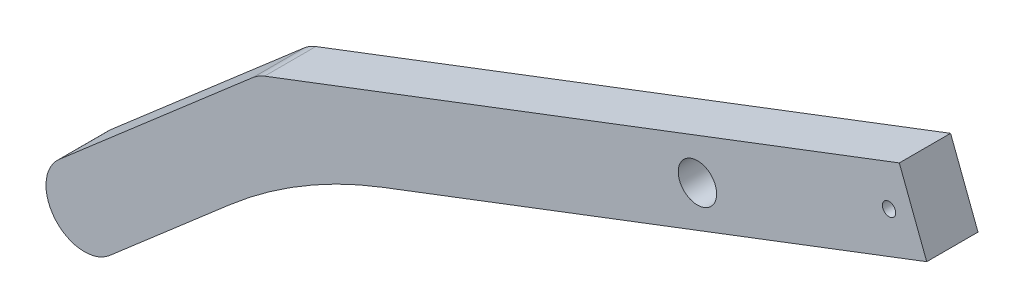
ISO-10303-21;
HEADER;
FILE_DESCRIPTION(('STEP AP214'),'2;1');
FILE_NAME('part.step','',(''),(''),'','','');
FILE_SCHEMA(('AUTOMOTIVE_DESIGN { 1 0 10303 214 1 1 1 1 }'));
ENDSEC;
DATA;
#1=APPLICATION_CONTEXT('core data for automotive mechanical design processes');
#2=APPLICATION_PROTOCOL_DEFINITION('international standard','automotive_design',2000,#1);
#3=PRODUCT_CONTEXT('',#1,'mechanical');
#4=PRODUCT('Part','Part','',(#3));
#5=PRODUCT_RELATED_PRODUCT_CATEGORY('part','',(#4));
#6=PRODUCT_DEFINITION_FORMATION('','',#4);
#7=PRODUCT_DEFINITION_CONTEXT('part definition',#1,'design');
#8=PRODUCT_DEFINITION('design','',#6,#7);
#9=PRODUCT_DEFINITION_SHAPE('','',#8);
#10=(LENGTH_UNIT() NAMED_UNIT(*) SI_UNIT(.MILLI.,.METRE.));
#11=(NAMED_UNIT(*) PLANE_ANGLE_UNIT() SI_UNIT($,.RADIAN.));
#12=(NAMED_UNIT(*) SI_UNIT($,.STERADIAN.) SOLID_ANGLE_UNIT());
#13=UNCERTAINTY_MEASURE_WITH_UNIT(LENGTH_MEASURE(1.E-05),#10,'distance_accuracy_value','');
#14=(GEOMETRIC_REPRESENTATION_CONTEXT(3) GLOBAL_UNCERTAINTY_ASSIGNED_CONTEXT((#13)) GLOBAL_UNIT_ASSIGNED_CONTEXT((#10,
#11,#12)) REPRESENTATION_CONTEXT('',''));
#15=CARTESIAN_POINT('',(0.,0.,0.));
#16=DIRECTION('',(0.,0.,1.));
#17=DIRECTION('',(1.,0.,0.));
#18=AXIS2_PLACEMENT_3D('',#15,#16,#17);
#19=CARTESIAN_POINT('',(31.7044109962568,-202.384831437495,20.));
#20=DIRECTION('',(0.,0.,-1.));
#21=DIRECTION('',(-1.,0.,0.));
#22=AXIS2_PLACEMENT_3D('',#19,#20,#21);
#23=CYLINDRICAL_SURFACE('',#22,200.);
#24=CARTESIAN_POINT('',(31.7044109962568,-202.384831437495,0.));
#25=DIRECTION('',(0.,0.,1.));
#26=DIRECTION('',(1.,0.,0.));
#27=AXIS2_PLACEMENT_3D('',#24,#25,#26);
#28=CIRCLE('',#27,200.);
#29=CARTESIAN_POINT('',(-39.5973696504079,-15.5264463523863,0.));
#30=VERTEX_POINT('',#29);
#31=CARTESIAN_POINT('',(-99.2066777747206,-51.1820310771936,0.));
#32=VERTEX_POINT('',#31);
#33=EDGE_CURVE('E173',#30,#32,#28,.T.);
#34=ORIENTED_EDGE('',*,*,#33,.F.);
#35=DIRECTION('',(0.,0.,-1.));
#36=VECTOR('',#35,1.);
#37=CARTESIAN_POINT('',(-39.5973696504079,-15.5264463523863,20.));
#38=LINE('',#37,#36);
#39=CARTESIAN_POINT('',(-39.5973696504079,-15.5264463523863,20.));
#40=VERTEX_POINT('',#39);
#41=EDGE_CURVE('E11',#40,#30,#38,.T.);
#42=ORIENTED_EDGE('',*,*,#41,.F.);
#43=CARTESIAN_POINT('',(31.7044109962568,-202.384831437495,20.));
#44=DIRECTION('',(0.,0.,1.));
#45=DIRECTION('',(1.,0.,0.));
#46=AXIS2_PLACEMENT_3D('',#43,#44,#45);
#47=CIRCLE('',#46,200.);
#48=CARTESIAN_POINT('',(-99.2066777747206,-51.1820310771936,20.));
#49=VERTEX_POINT('',#48);
#50=EDGE_CURVE('E256',#40,#49,#47,.T.);
#51=ORIENTED_EDGE('',*,*,#50,.T.);
#52=DIRECTION('',(0.,0.,-1.));
#53=VECTOR('',#52,1.);
#54=CARTESIAN_POINT('',(-99.2066777747206,-51.1820310771936,20.));
#55=LINE('',#54,#53);
#56=EDGE_CURVE('E97',#49,#32,#55,.T.);
#57=ORIENTED_EDGE('',*,*,#56,.T.);
#58=EDGE_LOOP('',(#34,#42,#51,#57));
#59=FACE_BOUND('',#58,.T.);
#60=ADVANCED_FACE('F45',(#59),#23,.F.);
#61=CARTESIAN_POINT('',(0.138831209605437,-0.363830684044743,20.));
#62=DIRECTION('',(-0.356508903233323,0.934291925425545,0.));
#63=DIRECTION('',(-0.934291925425545,-0.356508903233323,0.));
#64=AXIS2_PLACEMENT_3D('',#61,#62,#63);
#65=PLANE('',#64);
#66=DIRECTION('',(0.934291925425546,0.356508903233324,0.));
#67=VECTOR('',#66,1.);
#68=CARTESIAN_POINT('',(0.138831209605437,-0.363830684044743,0.));
#69=LINE('',#68,#67);
#70=CARTESIAN_POINT('',(172.570702610587,65.4330532263387,0.));
#71=VERTEX_POINT('',#70);
#72=EDGE_CURVE('E170',#30,#71,#69,.T.);
#73=ORIENTED_EDGE('',*,*,#72,.T.);
#74=DIRECTION('',(0.,0.,-1.));
#75=VECTOR('',#74,1.);
#76=CARTESIAN_POINT('',(172.570702610587,65.4330532263387,20.));
#77=LINE('',#76,#75);
#78=CARTESIAN_POINT('',(172.570702610587,65.4330532263387,20.));
#79=VERTEX_POINT('',#78);
#80=EDGE_CURVE('E55',#79,#71,#77,.T.);
#81=ORIENTED_EDGE('',*,*,#80,.F.);
#82=DIRECTION('',(0.934291925425546,0.356508903233324,0.));
#83=VECTOR('',#82,1.);
#84=CARTESIAN_POINT('',(0.138831209605437,-0.363830684044743,20.));
#85=LINE('',#84,#83);
#86=EDGE_CURVE('E259',#40,#79,#85,.T.);
#87=ORIENTED_EDGE('',*,*,#86,.F.);
#88=ORIENTED_EDGE('',*,*,#41,.T.);
#89=EDGE_LOOP('',(#73,#81,#87,#88));
#90=FACE_BOUND('',#89,.T.);
#91=ADVANCED_FACE('F171',(#90),#65,.F.);
#92=CARTESIAN_POINT('',(172.431871400981,65.7968839103834,20.));
#93=DIRECTION('',(-0.934291925425545,-0.356508903233323,0.));
#94=DIRECTION('',(0.356508903233323,-0.934291925425546,0.));
#95=AXIS2_PLACEMENT_3D('',#92,#93,#94);
#96=PLANE('',#95);
#97=DIRECTION('',(-0.356508903233323,0.934291925425545,0.));
#98=VECTOR('',#97,1.);
#99=CARTESIAN_POINT('',(172.431871400981,65.7968839103834,0.));
#100=LINE('',#99,#98);
#101=CARTESIAN_POINT('',(161.875435513587,93.4618109891051,0.));
#102=VERTEX_POINT('',#101);
#103=EDGE_CURVE('E164',#71,#102,#100,.T.);
#104=ORIENTED_EDGE('',*,*,#103,.T.);
#105=DIRECTION('',(0.,0.,-1.));
#106=VECTOR('',#105,1.);
#107=CARTESIAN_POINT('',(161.875435513587,93.4618109891051,20.));
#108=LINE('',#107,#106);
#109=CARTESIAN_POINT('',(161.875435513587,93.4618109891051,20.));
#110=VERTEX_POINT('',#109);
#111=EDGE_CURVE('E153',#110,#102,#108,.T.);
#112=ORIENTED_EDGE('',*,*,#111,.F.);
#113=DIRECTION('',(-0.356508903233323,0.934291925425545,0.));
#114=VECTOR('',#113,1.);
#115=CARTESIAN_POINT('',(172.431871400981,65.7968839103834,20.));
#116=LINE('',#115,#114);
#117=EDGE_CURVE('E166',#79,#110,#116,.T.);
#118=ORIENTED_EDGE('',*,*,#117,.F.);
#119=ORIENTED_EDGE('',*,*,#80,.T.);
#120=EDGE_LOOP('',(#104,#112,#118,#119));
#121=FACE_BOUND('',#120,.T.);
#122=ADVANCED_FACE('F162',(#121),#96,.F.);
#123=CARTESIAN_POINT('',(-10.5564358873943,27.6649270787216,20.));
#124=DIRECTION('',(0.356508903233323,-0.934291925425546,0.));
#125=DIRECTION('',(0.934291925425546,0.356508903233323,0.));
#126=AXIS2_PLACEMENT_3D('',#123,#124,#125);
#127=PLANE('',#126);
#128=DIRECTION('',(-0.934291925425546,-0.356508903233323,0.));
#129=VECTOR('',#128,1.);
#130=CARTESIAN_POINT('',(-10.5564358873943,27.6649270787216,0.));
#131=LINE('',#130,#129);
#132=CARTESIAN_POINT('',(-85.7119247241827,-1.01304836772561,0.));
#133=VERTEX_POINT('',#132);
#134=EDGE_CURVE('E177',#102,#133,#131,.T.);
#135=ORIENTED_EDGE('',*,*,#134,.T.);
#136=DIRECTION('',(0.,0.,-1.));
#137=VECTOR('',#136,1.);
#138=CARTESIAN_POINT('',(-85.7119247241827,-1.01304836772561,20.));
#139=LINE('',#138,#137);
#140=CARTESIAN_POINT('',(-85.7119247241827,-1.01304836772561,20.));
#141=VERTEX_POINT('',#140);
#142=EDGE_CURVE('E145',#141,#133,#139,.T.);
#143=ORIENTED_EDGE('',*,*,#142,.F.);
#144=DIRECTION('',(-0.934291925425546,-0.356508903233323,0.));
#145=VECTOR('',#144,1.);
#146=CARTESIAN_POINT('',(-10.5564358873943,27.6649270787216,20.));
#147=LINE('',#146,#145);
#148=EDGE_CURVE('E266',#110,#141,#147,.T.);
#149=ORIENTED_EDGE('',*,*,#148,.F.);
#150=ORIENTED_EDGE('',*,*,#111,.T.);
#151=EDGE_LOOP('',(#135,#143,#149,#150));
#152=FACE_BOUND('',#151,.T.);
#153=ADVANCED_FACE('F236',(#152),#127,.F.);
#154=CARTESIAN_POINT('',(-80.3642911756828,-15.0274272491088,20.));
#155=DIRECTION('',(0.,0.,-1.));
#156=DIRECTION('',(-1.,0.,0.));
#157=AXIS2_PLACEMENT_3D('',#154,#155,#156);
#158=CYLINDRICAL_SURFACE('',#157,15.);
#159=CARTESIAN_POINT('',(-80.3642911756828,-15.0274272491088,0.));
#160=DIRECTION('',(0.,0.,1.));
#161=DIRECTION('',(1.,0.,0.));
#162=AXIS2_PLACEMENT_3D('',#159,#160,#161);
#163=CIRCLE('',#162,15.);
#164=CARTESIAN_POINT('',(-90.1826228335061,-3.68721722208618,0.));
#165=VERTEX_POINT('',#164);
#166=EDGE_CURVE('E186',#133,#165,#163,.T.);
#167=ORIENTED_EDGE('',*,*,#166,.T.);
#168=DIRECTION('',(0.,0.,-1.));
#169=VECTOR('',#168,1.);
#170=CARTESIAN_POINT('',(-90.1826228335061,-3.68721722208618,20.));
#171=LINE('',#170,#169);
#172=CARTESIAN_POINT('',(-90.1826228335061,-3.68721722208618,20.));
#173=VERTEX_POINT('',#172);
#174=EDGE_CURVE('E141',#173,#165,#171,.T.);
#175=ORIENTED_EDGE('',*,*,#174,.F.);
#176=CARTESIAN_POINT('',(-80.3642911756828,-15.0274272491088,20.));
#177=DIRECTION('',(0.,0.,1.));
#178=DIRECTION('',(1.,0.,0.));
#179=AXIS2_PLACEMENT_3D('',#176,#177,#178);
#180=CIRCLE('',#179,15.);
#181=EDGE_CURVE('E132',#141,#173,#180,.T.);
#182=ORIENTED_EDGE('',*,*,#181,.F.);
#183=ORIENTED_EDGE('',*,*,#142,.T.);
#184=EDGE_LOOP('',(#167,#175,#182,#183));
#185=FACE_BOUND('',#184,.T.);
#186=ADVANCED_FACE('F239',(#185),#158,.T.);
#187=CARTESIAN_POINT('',(-36.8134672597904,42.5196932735817,20.));
#188=DIRECTION('',(0.654555443854887,-0.756014001801509,0.));
#189=DIRECTION('',(0.756014001801509,0.654555443854887,0.));
#190=AXIS2_PLACEMENT_3D('',#187,#188,#189);
#191=PLANE('',#190);
#192=DIRECTION('',(-0.756014001801509,-0.654555443854887,0.));
#193=VECTOR('',#192,1.);
#194=CARTESIAN_POINT('',(-36.8134672597904,42.5196932735817,0.));
#195=LINE('',#194,#193);
#196=CARTESIAN_POINT('',(-165.784023013657,-69.1427616075749,0.));
#197=VERTEX_POINT('',#196);
#198=EDGE_CURVE('E139',#165,#197,#195,.T.);
#199=ORIENTED_EDGE('',*,*,#198,.T.);
#200=DIRECTION('',(0.,0.,-1.));
#201=VECTOR('',#200,1.);
#202=CARTESIAN_POINT('',(-165.784023013657,-69.1427616075749,20.));
#203=LINE('',#202,#201);
#204=CARTESIAN_POINT('',(-165.784023013657,-69.1427616075749,20.));
#205=VERTEX_POINT('',#204);
#206=EDGE_CURVE('E122',#205,#197,#203,.T.);
#207=ORIENTED_EDGE('',*,*,#206,.F.);
#208=DIRECTION('',(-0.756014001801509,-0.654555443854887,0.));
#209=VECTOR('',#208,1.);
#210=CARTESIAN_POINT('',(-36.8134672597904,42.5196932735817,20.));
#211=LINE('',#210,#209);
#212=EDGE_CURVE('E126',#173,#205,#211,.T.);
#213=ORIENTED_EDGE('',*,*,#212,.F.);
#214=ORIENTED_EDGE('',*,*,#174,.T.);
#215=EDGE_LOOP('',(#199,#207,#213,#214));
#216=FACE_BOUND('',#215,.T.);
#217=ADVANCED_FACE('F138',(#216),#191,.F.);
#218=CARTESIAN_POINT('',(-155.965691355834,-80.4829716345975,20.));
#219=DIRECTION('',(0.,0.,-1.));
#220=DIRECTION('',(-1.,0.,0.));
#221=AXIS2_PLACEMENT_3D('',#218,#219,#220);
#222=CYLINDRICAL_SURFACE('',#221,15.);
#223=CARTESIAN_POINT('',(-155.965691355834,-80.4829716345975,0.));
#224=DIRECTION('',(0.,0.,1.));
#225=DIRECTION('',(1.,0.,0.));
#226=AXIS2_PLACEMENT_3D('',#223,#224,#225);
#227=CIRCLE('',#226,15.);
#228=CARTESIAN_POINT('',(-146.14735969801,-91.8231816616201,0.));
#229=VERTEX_POINT('',#228);
#230=EDGE_CURVE('E192',#197,#229,#227,.T.);
#231=ORIENTED_EDGE('',*,*,#230,.T.);
#232=DIRECTION('',(0.,0.,-1.));
#233=VECTOR('',#232,1.);
#234=CARTESIAN_POINT('',(-146.14735969801,-91.8231816616201,20.));
#235=LINE('',#234,#233);
#236=CARTESIAN_POINT('',(-146.14735969801,-91.8231816616201,20.));
#237=VERTEX_POINT('',#236);
#238=EDGE_CURVE('E124',#237,#229,#235,.T.);
#239=ORIENTED_EDGE('',*,*,#238,.F.);
#240=CARTESIAN_POINT('',(-155.965691355834,-80.4829716345975,20.));
#241=DIRECTION('',(0.,0.,1.));
#242=DIRECTION('',(1.,0.,0.));
#243=AXIS2_PLACEMENT_3D('',#240,#241,#242);
#244=CIRCLE('',#243,15.);
#245=EDGE_CURVE('E117',#205,#237,#244,.T.);
#246=ORIENTED_EDGE('',*,*,#245,.F.);
#247=ORIENTED_EDGE('',*,*,#206,.T.);
#248=EDGE_LOOP('',(#231,#239,#246,#247));
#249=FACE_BOUND('',#248,.T.);
#250=ADVANCED_FACE('F120',(#249),#222,.T.);
#251=CARTESIAN_POINT('',(-17.1768039441438,19.8392732195365,20.));
#252=DIRECTION('',(-0.654555443854887,0.756014001801509,0.));
#253=DIRECTION('',(-0.756014001801509,-0.654555443854887,0.));
#254=AXIS2_PLACEMENT_3D('',#251,#252,#253);
#255=PLANE('',#254);
#256=DIRECTION('',(0.756014001801509,0.654555443854887,0.));
#257=VECTOR('',#256,1.);
#258=CARTESIAN_POINT('',(-17.1768039441438,19.8392732195365,0.));
#259=LINE('',#258,#257);
#260=EDGE_CURVE('E90',#229,#32,#259,.T.);
#261=ORIENTED_EDGE('',*,*,#260,.T.);
#262=ORIENTED_EDGE('',*,*,#56,.F.);
#263=DIRECTION('',(0.756014001801509,0.654555443854887,0.));
#264=VECTOR('',#263,1.);
#265=CARTESIAN_POINT('',(-17.1768039441438,19.8392732195365,20.));
#266=LINE('',#265,#264);
#267=EDGE_CURVE('E63',#237,#49,#266,.T.);
#268=ORIENTED_EDGE('',*,*,#267,.F.);
#269=ORIENTED_EDGE('',*,*,#238,.T.);
#270=EDGE_LOOP('',(#261,#262,#268,#269));
#271=FACE_BOUND('',#270,.T.);
#272=ADVANCED_FACE('F218',(#271),#255,.F.);
#273=CARTESIAN_POINT('',(83.1367957737876,47.3616308167228,20.));
#274=DIRECTION('',(0.,0.,-1.));
#275=DIRECTION('',(-1.,0.,0.));
#276=AXIS2_PLACEMENT_3D('',#273,#274,#275);
#277=CYLINDRICAL_SURFACE('',#276,7.5);
#278=CARTESIAN_POINT('',(83.1367957737876,47.3616308167228,20.));
#279=DIRECTION('',(0.,0.,1.));
#280=DIRECTION('',(1.,0.,0.));
#281=AXIS2_PLACEMENT_3D('',#278,#279,#280);
#282=CIRCLE('',#281,7.5);
#283=CARTESIAN_POINT('',(90.6367957737876,47.3616308167228,20.));
#284=VERTEX_POINT('',#283);
#285=EDGE_CURVE('E200',#284,#284,#282,.T.);
#286=ORIENTED_EDGE('',*,*,#285,.T.);
#287=EDGE_LOOP('',(#286));
#288=FACE_BOUND('',#287,.T.);
#289=CARTESIAN_POINT('',(83.1367957737876,47.3616308167228,0.));
#290=DIRECTION('',(0.,0.,1.));
#291=DIRECTION('',(1.,0.,0.));
#292=AXIS2_PLACEMENT_3D('',#289,#290,#291);
#293=CIRCLE('',#292,7.5);
#294=CARTESIAN_POINT('',(90.6367957737876,47.3616308167228,0.));
#295=VERTEX_POINT('',#294);
#296=EDGE_CURVE('E179',#295,#295,#293,.T.);
#297=ORIENTED_EDGE('',*,*,#296,.F.);
#298=EDGE_LOOP('',(#297));
#299=FACE_BOUND('',#298,.T.);
#300=ADVANCED_FACE('F47',(#288,#299),#277,.F.);
#301=CARTESIAN_POINT('',(157.880149807831,75.8823430753887,20.));
#302=DIRECTION('',(0.,0.,-1.));
#303=DIRECTION('',(-1.,0.,0.));
#304=AXIS2_PLACEMENT_3D('',#301,#302,#303);
#305=CYLINDRICAL_SURFACE('',#304,2.60000000000001);
#306=CARTESIAN_POINT('',(157.880149807831,75.8823430753887,20.));
#307=DIRECTION('',(0.,0.,1.));
#308=DIRECTION('',(1.,0.,0.));
#309=AXIS2_PLACEMENT_3D('',#306,#307,#308);
#310=CIRCLE('',#309,2.60000000000001);
#311=CARTESIAN_POINT('',(160.480149807831,75.8823430753887,20.));
#312=VERTEX_POINT('',#311);
#313=EDGE_CURVE('E202',#312,#312,#310,.T.);
#314=ORIENTED_EDGE('',*,*,#313,.T.);
#315=EDGE_LOOP('',(#314));
#316=FACE_BOUND('',#315,.T.);
#317=CARTESIAN_POINT('',(157.880149807831,75.8823430753887,0.));
#318=DIRECTION('',(0.,0.,1.));
#319=DIRECTION('',(1.,0.,0.));
#320=AXIS2_PLACEMENT_3D('',#317,#318,#319);
#321=CIRCLE('',#320,2.60000000000001);
#322=CARTESIAN_POINT('',(160.480149807831,75.8823430753887,0.));
#323=VERTEX_POINT('',#322);
#324=EDGE_CURVE('E197',#323,#323,#321,.T.);
#325=ORIENTED_EDGE('',*,*,#324,.F.);
#326=EDGE_LOOP('',(#325));
#327=FACE_BOUND('',#326,.T.);
#328=ADVANCED_FACE('F217',(#316,#327),#305,.F.);
#329=CARTESIAN_POINT('',(0.,0.,20.));
#330=DIRECTION('',(0.,0.,1.));
#331=DIRECTION('',(1.,0.,0.));
#332=AXIS2_PLACEMENT_3D('',#329,#330,#331);
#333=PLANE('',#332);
#334=ORIENTED_EDGE('',*,*,#285,.F.);
#335=EDGE_LOOP('',(#334));
#336=FACE_BOUND('',#335,.T.);
#337=ORIENTED_EDGE('',*,*,#50,.F.);
#338=ORIENTED_EDGE('',*,*,#86,.T.);
#339=ORIENTED_EDGE('',*,*,#117,.T.);
#340=ORIENTED_EDGE('',*,*,#148,.T.);
#341=ORIENTED_EDGE('',*,*,#181,.T.);
#342=ORIENTED_EDGE('',*,*,#212,.T.);
#343=ORIENTED_EDGE('',*,*,#245,.T.);
#344=ORIENTED_EDGE('',*,*,#267,.T.);
#345=EDGE_LOOP('',(#337,#338,#339,#340,#341,#342,#343,#344));
#346=FACE_BOUND('',#345,.T.);
#347=ORIENTED_EDGE('',*,*,#313,.F.);
#348=EDGE_LOOP('',(#347));
#349=FACE_BOUND('',#348,.T.);
#350=ADVANCED_FACE('F129',(#336,#346,#349),#333,.T.);
#351=CARTESIAN_POINT('',(0.,0.,0.));
#352=DIRECTION('',(0.,0.,1.));
#353=DIRECTION('',(1.,0.,0.));
#354=AXIS2_PLACEMENT_3D('',#351,#352,#353);
#355=PLANE('',#354);
#356=ORIENTED_EDGE('',*,*,#296,.T.);
#357=EDGE_LOOP('',(#356));
#358=FACE_BOUND('',#357,.T.);
#359=ORIENTED_EDGE('',*,*,#33,.T.);
#360=ORIENTED_EDGE('',*,*,#260,.F.);
#361=ORIENTED_EDGE('',*,*,#230,.F.);
#362=ORIENTED_EDGE('',*,*,#198,.F.);
#363=ORIENTED_EDGE('',*,*,#166,.F.);
#364=ORIENTED_EDGE('',*,*,#134,.F.);
#365=ORIENTED_EDGE('',*,*,#103,.F.);
#366=ORIENTED_EDGE('',*,*,#72,.F.);
#367=EDGE_LOOP('',(#359,#360,#361,#362,#363,#364,#365,#366));
#368=FACE_BOUND('',#367,.T.);
#369=ORIENTED_EDGE('',*,*,#324,.T.);
#370=EDGE_LOOP('',(#369));
#371=FACE_BOUND('',#370,.T.);
#372=ADVANCED_FACE('F214',(#358,#368,#371),#355,.F.);
#373=CLOSED_SHELL('',(#60,#91,#122,#153,#186,#217,#250,#272,#300,#328,#350,#372));
#374=MANIFOLD_SOLID_BREP('B2',#373);
#375=ADVANCED_BREP_SHAPE_REPRESENTATION('',(#18,#374),#14);
#376=SHAPE_DEFINITION_REPRESENTATION(#9,#375);
ENDSEC;
END-ISO-10303-21;
